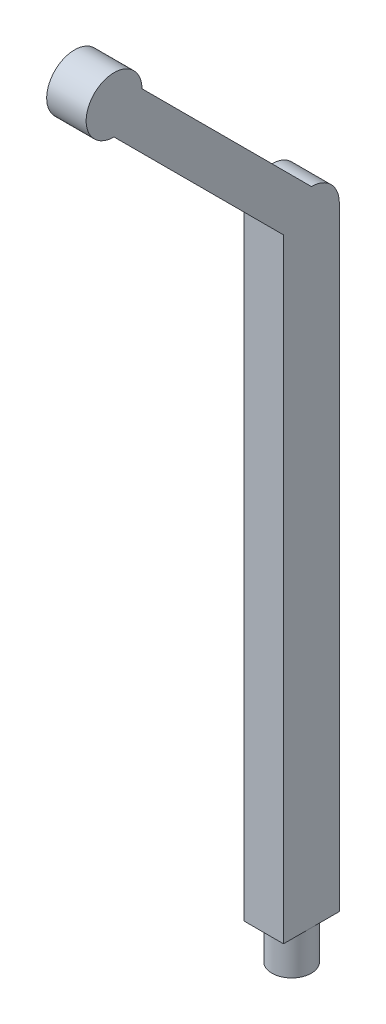
ISO-10303-21;
HEADER;
FILE_DESCRIPTION(('STEP AP214'),'2;1');
FILE_NAME('part.step','',(''),(''),'','','');
FILE_SCHEMA(('AUTOMOTIVE_DESIGN { 1 0 10303 214 1 1 1 1 }'));
ENDSEC;
DATA;
#1=APPLICATION_CONTEXT('core data for automotive mechanical design processes');
#2=APPLICATION_PROTOCOL_DEFINITION('international standard','automotive_design',2000,#1);
#3=PRODUCT_CONTEXT('',#1,'mechanical');
#4=PRODUCT('Part','Part','',(#3));
#5=PRODUCT_RELATED_PRODUCT_CATEGORY('part','',(#4));
#6=PRODUCT_DEFINITION_FORMATION('','',#4);
#7=PRODUCT_DEFINITION_CONTEXT('part definition',#1,'design');
#8=PRODUCT_DEFINITION('design','',#6,#7);
#9=PRODUCT_DEFINITION_SHAPE('','',#8);
#10=(LENGTH_UNIT() NAMED_UNIT(*) SI_UNIT(.MILLI.,.METRE.));
#11=(NAMED_UNIT(*) PLANE_ANGLE_UNIT() SI_UNIT($,.RADIAN.));
#12=(NAMED_UNIT(*) SI_UNIT($,.STERADIAN.) SOLID_ANGLE_UNIT());
#13=UNCERTAINTY_MEASURE_WITH_UNIT(LENGTH_MEASURE(1.E-05),#10,'distance_accuracy_value','');
#14=(GEOMETRIC_REPRESENTATION_CONTEXT(3) GLOBAL_UNCERTAINTY_ASSIGNED_CONTEXT((#13)) GLOBAL_UNIT_ASSIGNED_CONTEXT((#10,
#11,#12)) REPRESENTATION_CONTEXT('',''));
#15=CARTESIAN_POINT('',(0.,0.,0.));
#16=DIRECTION('',(0.,0.,1.));
#17=DIRECTION('',(1.,0.,0.));
#18=AXIS2_PLACEMENT_3D('',#15,#16,#17);
#19=CARTESIAN_POINT('',(10.,-77.7817459305213,0.));
#20=DIRECTION('',(0.,1.,0.));
#21=DIRECTION('',(0.,0.,1.));
#22=AXIS2_PLACEMENT_3D('',#19,#20,#21);
#23=PLANE('',#22);
#24=CARTESIAN_POINT('',(5.,-77.7817459305213,0.));
#25=DIRECTION('',(0.,-1.,0.));
#26=DIRECTION('',(0.,0.,-1.));
#27=AXIS2_PLACEMENT_3D('',#24,#25,#26);
#28=CIRCLE('',#27,5.);
#29=CARTESIAN_POINT('',(10.,-77.7817459305213,0.));
#30=VERTEX_POINT('',#29);
#31=CARTESIAN_POINT('',(0.,-77.7817459305213,0.));
#32=VERTEX_POINT('',#31);
#33=EDGE_CURVE('E74',#30,#32,#28,.T.);
#34=ORIENTED_EDGE('',*,*,#33,.F.);
#35=DIRECTION('',(0.,0.,-1.));
#36=VECTOR('',#35,1.);
#37=CARTESIAN_POINT('',(10.,-77.7817459305213,0.));
#38=LINE('',#37,#36);
#39=CARTESIAN_POINT('',(10.,-77.7817459305213,7.07106781186555));
#40=VERTEX_POINT('',#39);
#41=EDGE_CURVE('E200',#40,#30,#38,.T.);
#42=ORIENTED_EDGE('',*,*,#41,.F.);
#43=DIRECTION('',(-1.,0.,0.));
#44=VECTOR('',#43,1.);
#45=CARTESIAN_POINT('',(10.,-77.7817459305213,7.07106781186555));
#46=LINE('',#45,#44);
#47=CARTESIAN_POINT('',(0.,-77.7817459305213,7.07106781186555));
#48=VERTEX_POINT('',#47);
#49=EDGE_CURVE('E185',#40,#48,#46,.T.);
#50=ORIENTED_EDGE('',*,*,#49,.T.);
#51=DIRECTION('',(0.,0.,-1.));
#52=VECTOR('',#51,1.);
#53=CARTESIAN_POINT('',(0.,-77.7817459305213,0.));
#54=LINE('',#53,#52);
#55=EDGE_CURVE('E170',#48,#32,#54,.T.);
#56=ORIENTED_EDGE('',*,*,#55,.T.);
#57=EDGE_LOOP('',(#34,#42,#50,#56));
#58=FACE_BOUND('',#57,.T.);
#59=ADVANCED_FACE('F63',(#58),#23,.F.);
#60=CARTESIAN_POINT('',(10.,0.,7.07106781186556));
#61=DIRECTION('',(0.,0.,-1.));
#62=DIRECTION('',(0.,1.,0.));
#63=AXIS2_PLACEMENT_3D('',#60,#61,#62);
#64=PLANE('',#63);
#65=DIRECTION('',(0.,-1.,0.));
#66=VECTOR('',#65,1.);
#67=CARTESIAN_POINT('',(0.,0.,7.07106781186556));
#68=LINE('',#67,#66);
#69=CARTESIAN_POINT('',(0.,77.7817459305208,7.07106781186557));
#70=VERTEX_POINT('',#69);
#71=EDGE_CURVE('E166',#70,#48,#68,.T.);
#72=ORIENTED_EDGE('',*,*,#71,.T.);
#73=ORIENTED_EDGE('',*,*,#49,.F.);
#74=DIRECTION('',(0.,-1.,0.));
#75=VECTOR('',#74,1.);
#76=CARTESIAN_POINT('',(10.,0.,7.07106781186556));
#77=LINE('',#76,#75);
#78=CARTESIAN_POINT('',(10.,77.7817459305208,7.07106781186557));
#79=VERTEX_POINT('',#78);
#80=EDGE_CURVE('E124',#79,#40,#77,.T.);
#81=ORIENTED_EDGE('',*,*,#80,.F.);
#82=DIRECTION('',(-1.,0.,0.));
#83=VECTOR('',#82,1.);
#84=CARTESIAN_POINT('',(10.,77.7817459305208,7.07106781186557));
#85=LINE('',#84,#83);
#86=EDGE_CURVE('E72',#79,#70,#85,.T.);
#87=ORIENTED_EDGE('',*,*,#86,.T.);
#88=EDGE_LOOP('',(#72,#73,#81,#87));
#89=FACE_BOUND('',#88,.T.);
#90=ADVANCED_FACE('F211',(#89),#64,.F.);
#91=EDGE_CURVE('E12',#32,#30,#28,.T.);
#92=ORIENTED_EDGE('',*,*,#91,.F.);
#93=CARTESIAN_POINT('',(0.,-77.7817459305213,-7.07106781186555));
#94=VERTEX_POINT('',#93);
#95=EDGE_CURVE('E169',#32,#94,#54,.T.);
#96=ORIENTED_EDGE('',*,*,#95,.T.);
#97=DIRECTION('',(-1.,0.,0.));
#98=VECTOR('',#97,1.);
#99=CARTESIAN_POINT('',(10.,-77.7817459305213,-7.07106781186555));
#100=LINE('',#99,#98);
#101=CARTESIAN_POINT('',(10.,-77.7817459305213,-7.07106781186555));
#102=VERTEX_POINT('',#101);
#103=EDGE_CURVE('E182',#102,#94,#100,.T.);
#104=ORIENTED_EDGE('',*,*,#103,.F.);
#105=EDGE_CURVE('E199',#30,#102,#38,.T.);
#106=ORIENTED_EDGE('',*,*,#105,.F.);
#107=EDGE_LOOP('',(#92,#96,#104,#106));
#108=FACE_BOUND('',#107,.T.);
#109=ADVANCED_FACE('F215',(#108),#23,.F.);
#110=CARTESIAN_POINT('',(10.,0.,-7.07106781186553));
#111=DIRECTION('',(0.,0.,-1.));
#112=DIRECTION('',(0.,1.,0.));
#113=AXIS2_PLACEMENT_3D('',#110,#111,#112);
#114=PLANE('',#113);
#115=DIRECTION('',(0.,-1.,0.));
#116=VECTOR('',#115,1.);
#117=CARTESIAN_POINT('',(0.,0.,-7.07106781186553));
#118=LINE('',#117,#116);
#119=CARTESIAN_POINT('',(0.,77.7817459305208,-7.0710678118655));
#120=VERTEX_POINT('',#119);
#121=EDGE_CURVE('E173',#120,#94,#118,.T.);
#122=ORIENTED_EDGE('',*,*,#121,.F.);
#123=DIRECTION('',(-1.,0.,0.));
#124=VECTOR('',#123,1.);
#125=CARTESIAN_POINT('',(10.,77.7817459305208,-7.0710678118655));
#126=LINE('',#125,#124);
#127=CARTESIAN_POINT('',(10.,77.7817459305208,-7.0710678118655));
#128=VERTEX_POINT('',#127);
#129=EDGE_CURVE('E156',#128,#120,#126,.T.);
#130=ORIENTED_EDGE('',*,*,#129,.F.);
#131=DIRECTION('',(0.,-1.,0.));
#132=VECTOR('',#131,1.);
#133=CARTESIAN_POINT('',(10.,0.,-7.07106781186553));
#134=LINE('',#133,#132);
#135=EDGE_CURVE('E145',#128,#102,#134,.T.);
#136=ORIENTED_EDGE('',*,*,#135,.T.);
#137=ORIENTED_EDGE('',*,*,#103,.T.);
#138=EDGE_LOOP('',(#122,#130,#136,#137));
#139=FACE_BOUND('',#138,.T.);
#140=ADVANCED_FACE('F204',(#139),#114,.T.);
#141=CARTESIAN_POINT('',(10.,77.7817459305208,0.));
#142=DIRECTION('',(-1.,0.,0.));
#143=DIRECTION('',(0.,0.,1.));
#144=AXIS2_PLACEMENT_3D('',#141,#142,#143);
#145=CYLINDRICAL_SURFACE('',#144,7.07106781186554);
#146=CARTESIAN_POINT('',(0.,77.7817459305208,0.));
#147=DIRECTION('',(1.,0.,0.));
#148=DIRECTION('',(0.,0.,-1.));
#149=AXIS2_PLACEMENT_3D('',#146,#147,#148);
#150=CIRCLE('',#149,7.07106781186554);
#151=CARTESIAN_POINT('',(0.,84.8528137423864,1.1666015375944E-13));
#152=VERTEX_POINT('',#151);
#153=EDGE_CURVE('E152',#120,#152,#150,.T.);
#154=ORIENTED_EDGE('',*,*,#153,.T.);
#155=DIRECTION('',(-1.,0.,0.));
#156=VECTOR('',#155,1.);
#157=CARTESIAN_POINT('',(10.,84.8528137423864,1.1666015375944E-13));
#158=LINE('',#157,#156);
#159=CARTESIAN_POINT('',(10.,84.8528137423864,1.1666015375944E-13));
#160=VERTEX_POINT('',#159);
#161=EDGE_CURVE('E149',#160,#152,#158,.T.);
#162=ORIENTED_EDGE('',*,*,#161,.F.);
#163=CARTESIAN_POINT('',(10.,77.7817459305208,0.));
#164=DIRECTION('',(1.,0.,0.));
#165=DIRECTION('',(0.,0.,-1.));
#166=AXIS2_PLACEMENT_3D('',#163,#164,#165);
#167=CIRCLE('',#166,7.07106781186554);
#168=EDGE_CURVE('E139',#128,#160,#167,.T.);
#169=ORIENTED_EDGE('',*,*,#168,.F.);
#170=ORIENTED_EDGE('',*,*,#129,.T.);
#171=EDGE_LOOP('',(#154,#162,#169,#170));
#172=FACE_BOUND('',#171,.T.);
#173=ADVANCED_FACE('F150',(#172),#145,.T.);
#174=CARTESIAN_POINT('',(10.,42.4264068711936,-42.4264068711931));
#175=DIRECTION('',(0.,-0.707106781186552,0.707106781186544));
#176=DIRECTION('',(0.,-0.707106781186544,-0.707106781186551));
#177=AXIS2_PLACEMENT_3D('',#174,#175,#176);
#178=PLANE('',#177);
#179=DIRECTION('',(0.,0.707106781186544,0.707106781186552));
#180=VECTOR('',#179,1.);
#181=CARTESIAN_POINT('',(0.,42.4264068711936,-42.4264068711931));
#182=LINE('',#181,#180);
#183=CARTESIAN_POINT('',(0.,127.781745930521,42.9289321881352));
#184=VERTEX_POINT('',#183);
#185=EDGE_CURVE('E177',#152,#184,#182,.T.);
#186=ORIENTED_EDGE('',*,*,#185,.T.);
#187=DIRECTION('',(-1.,0.,0.));
#188=VECTOR('',#187,1.);
#189=CARTESIAN_POINT('',(10.,127.781745930521,42.9289321881352));
#190=LINE('',#189,#188);
#191=CARTESIAN_POINT('',(10.,127.781745930521,42.9289321881352));
#192=VERTEX_POINT('',#191);
#193=EDGE_CURVE('E157',#192,#184,#190,.T.);
#194=ORIENTED_EDGE('',*,*,#193,.F.);
#195=DIRECTION('',(0.,0.707106781186544,0.707106781186552));
#196=VECTOR('',#195,1.);
#197=CARTESIAN_POINT('',(10.,42.4264068711936,-42.4264068711931));
#198=LINE('',#197,#196);
#199=EDGE_CURVE('E143',#160,#192,#198,.T.);
#200=ORIENTED_EDGE('',*,*,#199,.F.);
#201=ORIENTED_EDGE('',*,*,#161,.T.);
#202=EDGE_LOOP('',(#186,#194,#200,#201));
#203=FACE_BOUND('',#202,.T.);
#204=ADVANCED_FACE('F159',(#203),#178,.F.);
#205=CARTESIAN_POINT('',(10.,35.3553390593281,-35.3553390593277));
#206=DIRECTION('',(0.,0.707106781186551,-0.707106781186544));
#207=DIRECTION('',(0.,0.707106781186544,0.707106781186551));
#208=AXIS2_PLACEMENT_3D('',#205,#206,#207);
#209=PLANE('',#208);
#210=DIRECTION('',(0.,-0.707106781186544,-0.707106781186551));
#211=VECTOR('',#210,1.);
#212=CARTESIAN_POINT('',(0.,35.3553390593281,-35.3553390593277));
#213=LINE('',#212,#211);
#214=CARTESIAN_POINT('',(0.,120.710678118656,50.0000000000007));
#215=VERTEX_POINT('',#214);
#216=EDGE_CURVE('E164',#215,#70,#213,.T.);
#217=ORIENTED_EDGE('',*,*,#216,.T.);
#218=ORIENTED_EDGE('',*,*,#86,.F.);
#219=DIRECTION('',(0.,-0.707106781186544,-0.707106781186551));
#220=VECTOR('',#219,1.);
#221=CARTESIAN_POINT('',(10.,35.3553390593281,-35.3553390593277));
#222=LINE('',#221,#220);
#223=CARTESIAN_POINT('',(10.,120.710678118656,50.0000000000007));
#224=VERTEX_POINT('',#223);
#225=EDGE_CURVE('E178',#224,#79,#222,.T.);
#226=ORIENTED_EDGE('',*,*,#225,.F.);
#227=DIRECTION('',(-1.,0.,0.));
#228=VECTOR('',#227,1.);
#229=CARTESIAN_POINT('',(10.,120.710678118656,50.0000000000007));
#230=LINE('',#229,#228);
#231=EDGE_CURVE('E88',#224,#215,#230,.T.);
#232=ORIENTED_EDGE('',*,*,#231,.T.);
#233=EDGE_LOOP('',(#217,#218,#226,#232));
#234=FACE_BOUND('',#233,.T.);
#235=ADVANCED_FACE('F210',(#234),#209,.F.);
#236=CARTESIAN_POINT('',(0.,0.,0.));
#237=DIRECTION('',(1.,0.,0.));
#238=DIRECTION('',(0.,0.,-1.));
#239=AXIS2_PLACEMENT_3D('',#236,#237,#238);
#240=PLANE('',#239);
#241=ORIENTED_EDGE('',*,*,#216,.F.);
#242=CARTESIAN_POINT('',(0.,127.781745930521,50.0000000000007));
#243=DIRECTION('',(1.,0.,0.));
#244=DIRECTION('',(0.,0.,-1.));
#245=AXIS2_PLACEMENT_3D('',#242,#243,#244);
#246=CIRCLE('',#245,7.07106781186549);
#247=EDGE_CURVE('E67',#184,#215,#246,.T.);
#248=ORIENTED_EDGE('',*,*,#247,.F.);
#249=ORIENTED_EDGE('',*,*,#185,.F.);
#250=ORIENTED_EDGE('',*,*,#153,.F.);
#251=ORIENTED_EDGE('',*,*,#121,.T.);
#252=ORIENTED_EDGE('',*,*,#95,.F.);
#253=ORIENTED_EDGE('',*,*,#55,.F.);
#254=ORIENTED_EDGE('',*,*,#71,.F.);
#255=EDGE_LOOP('',(#241,#248,#249,#250,#251,#252,#253,#254));
#256=FACE_BOUND('',#255,.T.);
#257=ADVANCED_FACE('F207',(#256),#240,.F.);
#258=CARTESIAN_POINT('',(10.,0.,0.));
#259=DIRECTION('',(1.,0.,0.));
#260=DIRECTION('',(0.,0.,-1.));
#261=AXIS2_PLACEMENT_3D('',#258,#259,#260);
#262=PLANE('',#261);
#263=ORIENTED_EDGE('',*,*,#225,.T.);
#264=ORIENTED_EDGE('',*,*,#80,.T.);
#265=ORIENTED_EDGE('',*,*,#41,.T.);
#266=ORIENTED_EDGE('',*,*,#105,.T.);
#267=ORIENTED_EDGE('',*,*,#135,.F.);
#268=ORIENTED_EDGE('',*,*,#168,.T.);
#269=ORIENTED_EDGE('',*,*,#199,.T.);
#270=CARTESIAN_POINT('',(10.,127.781745930521,50.0000000000007));
#271=DIRECTION('',(1.,0.,0.));
#272=DIRECTION('',(0.,0.,-1.));
#273=AXIS2_PLACEMENT_3D('',#270,#271,#272);
#274=CIRCLE('',#273,7.07106781186549);
#275=EDGE_CURVE('E167',#192,#224,#274,.T.);
#276=ORIENTED_EDGE('',*,*,#275,.T.);
#277=EDGE_LOOP('',(#263,#264,#265,#266,#267,#268,#269,#276));
#278=FACE_BOUND('',#277,.T.);
#279=ADVANCED_FACE('F141',(#278),#262,.T.);
#280=CARTESIAN_POINT('',(10.,127.781745930521,50.0000000000007));
#281=DIRECTION('',(-1.,0.,0.));
#282=DIRECTION('',(0.,0.,1.));
#283=AXIS2_PLACEMENT_3D('',#280,#281,#282);
#284=CYLINDRICAL_SURFACE('',#283,7.07106781186549);
#285=ORIENTED_EDGE('',*,*,#247,.T.);
#286=ORIENTED_EDGE('',*,*,#231,.F.);
#287=ORIENTED_EDGE('',*,*,#275,.F.);
#288=ORIENTED_EDGE('',*,*,#193,.T.);
#289=EDGE_LOOP('',(#285,#286,#287,#288));
#290=FACE_BOUND('',#289,.T.);
#291=ADVANCED_FACE('F65',(#290),#284,.T.);
#292=CARTESIAN_POINT('',(5.,-87.7817459305213,0.));
#293=DIRECTION('',(0.,1.,0.));
#294=DIRECTION('',(0.,0.,1.));
#295=AXIS2_PLACEMENT_3D('',#292,#293,#294);
#296=CYLINDRICAL_SURFACE('',#295,5.);
#297=CARTESIAN_POINT('',(5.,-87.7817459305213,0.));
#298=DIRECTION('',(0.,-1.,0.));
#299=DIRECTION('',(0.,0.,-1.));
#300=AXIS2_PLACEMENT_3D('',#297,#298,#299);
#301=CIRCLE('',#300,5.);
#302=CARTESIAN_POINT('',(5.,-87.7817459305213,-5.));
#303=VERTEX_POINT('',#302);
#304=EDGE_CURVE('E188',#303,#303,#301,.T.);
#305=ORIENTED_EDGE('',*,*,#304,.F.);
#306=EDGE_LOOP('',(#305));
#307=FACE_BOUND('',#306,.T.);
#308=ORIENTED_EDGE('',*,*,#33,.T.);
#309=ORIENTED_EDGE('',*,*,#91,.T.);
#310=EDGE_LOOP('',(#308,#309));
#311=FACE_BOUND('',#310,.T.);
#312=ADVANCED_FACE('F217',(#307,#311),#296,.T.);
#313=CARTESIAN_POINT('',(5.,-87.7817459305213,0.));
#314=DIRECTION('',(0.,-1.,0.));
#315=DIRECTION('',(0.,0.,-1.));
#316=AXIS2_PLACEMENT_3D('',#313,#314,#315);
#317=PLANE('',#316);
#318=ORIENTED_EDGE('',*,*,#304,.T.);
#319=EDGE_LOOP('',(#318));
#320=FACE_BOUND('',#319,.T.);
#321=ADVANCED_FACE('F219',(#320),#317,.T.);
#322=CLOSED_SHELL('',(#59,#90,#109,#140,#173,#204,#235,#257,#279,#291,#312,#321));
#323=MANIFOLD_SOLID_BREP('B2',#322);
#324=ADVANCED_BREP_SHAPE_REPRESENTATION('',(#18,#323),#14);
#325=SHAPE_DEFINITION_REPRESENTATION(#9,#324);
ENDSEC;
END-ISO-10303-21;
